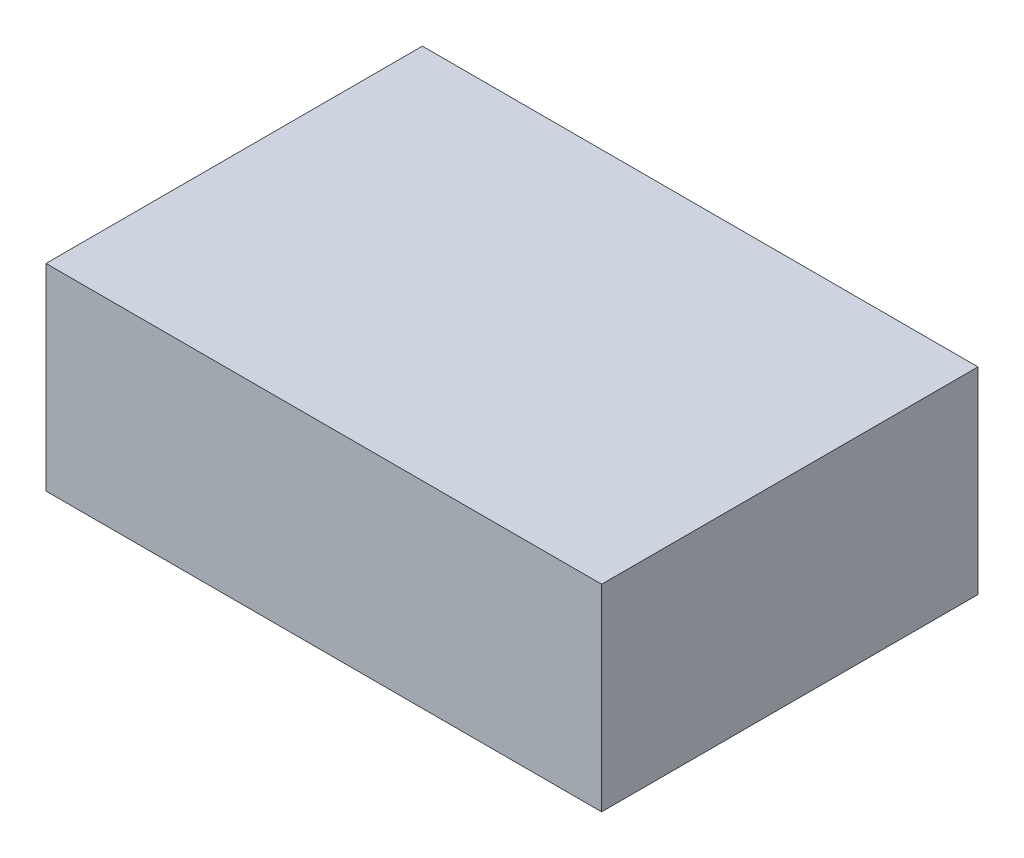
ISO-10303-21;
HEADER;
FILE_DESCRIPTION(('STEP AP214'),'2;1');
FILE_NAME('part.step','',(''),(''),'','','');
FILE_SCHEMA(('AUTOMOTIVE_DESIGN { 1 0 10303 214 1 1 1 1 }'));
ENDSEC;
DATA;
#1=APPLICATION_CONTEXT('core data for automotive mechanical design processes');
#2=APPLICATION_PROTOCOL_DEFINITION('international standard','automotive_design',2000,#1);
#3=PRODUCT_CONTEXT('',#1,'mechanical');
#4=PRODUCT('Part','Part','',(#3));
#5=PRODUCT_RELATED_PRODUCT_CATEGORY('part','',(#4));
#6=PRODUCT_DEFINITION_FORMATION('','',#4);
#7=PRODUCT_DEFINITION_CONTEXT('part definition',#1,'design');
#8=PRODUCT_DEFINITION('design','',#6,#7);
#9=PRODUCT_DEFINITION_SHAPE('','',#8);
#10=(LENGTH_UNIT() NAMED_UNIT(*) SI_UNIT(.MILLI.,.METRE.));
#11=(NAMED_UNIT(*) PLANE_ANGLE_UNIT() SI_UNIT($,.RADIAN.));
#12=(NAMED_UNIT(*) SI_UNIT($,.STERADIAN.) SOLID_ANGLE_UNIT());
#13=UNCERTAINTY_MEASURE_WITH_UNIT(LENGTH_MEASURE(1.E-05),#10,'distance_accuracy_value','');
#14=(GEOMETRIC_REPRESENTATION_CONTEXT(3) GLOBAL_UNCERTAINTY_ASSIGNED_CONTEXT((#13)) GLOBAL_UNIT_ASSIGNED_CONTEXT((#10,
#11,#12)) REPRESENTATION_CONTEXT('',''));
#15=CARTESIAN_POINT('',(0.,0.,0.));
#16=DIRECTION('',(0.,0.,1.));
#17=DIRECTION('',(1.,0.,0.));
#18=AXIS2_PLACEMENT_3D('',#15,#16,#17);
#19=CARTESIAN_POINT('',(0.,-152.4,-6096.));
#20=DIRECTION('',(0.,-1.,0.));
#21=DIRECTION('',(0.,0.,-1.));
#22=AXIS2_PLACEMENT_3D('',#19,#20,#21);
#23=PLANE('',#22);
#24=DIRECTION('',(0.,0.,1.));
#25=VECTOR('',#24,1.);
#26=CARTESIAN_POINT('',(-152.4,-152.4,-6096.));
#27=LINE('',#26,#25);
#28=CARTESIAN_POINT('',(-152.4,-152.4,-6248.4));
#29=VERTEX_POINT('',#28);
#30=CARTESIAN_POINT('',(-152.4,-152.4,152.4));
#31=VERTEX_POINT('',#30);
#32=EDGE_CURVE('E129',#29,#31,#27,.T.);
#33=ORIENTED_EDGE('',*,*,#32,.F.);
#34=DIRECTION('',(-1.,0.,0.));
#35=VECTOR('',#34,1.);
#36=CARTESIAN_POINT('',(0.,-152.4,-6248.4));
#37=LINE('',#36,#35);
#38=CARTESIAN_POINT('',(9296.4,-152.4,-6248.4));
#39=VERTEX_POINT('',#38);
#40=EDGE_CURVE('E106',#39,#29,#37,.T.);
#41=ORIENTED_EDGE('',*,*,#40,.F.);
#42=DIRECTION('',(0.,0.,-1.));
#43=VECTOR('',#42,1.);
#44=CARTESIAN_POINT('',(9296.4,-152.4,-6096.));
#45=LINE('',#44,#43);
#46=CARTESIAN_POINT('',(9296.4,-152.4,152.4));
#47=VERTEX_POINT('',#46);
#48=EDGE_CURVE('E115',#47,#39,#45,.T.);
#49=ORIENTED_EDGE('',*,*,#48,.F.);
#50=DIRECTION('',(1.,0.,0.));
#51=VECTOR('',#50,1.);
#52=CARTESIAN_POINT('',(0.,-152.4,152.4));
#53=LINE('',#52,#51);
#54=EDGE_CURVE('E123',#31,#47,#53,.T.);
#55=ORIENTED_EDGE('',*,*,#54,.F.);
#56=EDGE_LOOP('',(#33,#41,#49,#55));
#57=FACE_BOUND('',#56,.T.);
#58=CARTESIAN_POINT('',(4572.,-152.4,-3048.));
#59=DIRECTION('',(0.,-1.,0.));
#60=DIRECTION('',(0.,0.,-1.));
#61=AXIS2_PLACEMENT_3D('',#58,#59,#60);
#62=CIRCLE('',#61,596.298630589012);
#63=CARTESIAN_POINT('',(4572.,-152.4,-2451.70136941099));
#64=VERTEX_POINT('',#63);
#65=EDGE_CURVE('E144',#64,#64,#62,.T.);
#66=ORIENTED_EDGE('',*,*,#65,.F.);
#67=EDGE_LOOP('',(#66));
#68=FACE_BOUND('',#67,.T.);
#69=ADVANCED_FACE('F36',(#57,#68),#23,.T.);
#70=CARTESIAN_POINT('',(-152.4,3048.,0.));
#71=DIRECTION('',(1.,0.,0.));
#72=DIRECTION('',(0.,0.,-1.));
#73=AXIS2_PLACEMENT_3D('',#70,#71,#72);
#74=PLANE('',#73);
#75=ORIENTED_EDGE('',*,*,#32,.T.);
#76=DIRECTION('',(0.,-1.,0.));
#77=VECTOR('',#76,1.);
#78=CARTESIAN_POINT('',(-152.4,3048.,152.4));
#79=LINE('',#78,#77);
#80=CARTESIAN_POINT('',(-152.4,3200.4,152.4));
#81=VERTEX_POINT('',#80);
#82=EDGE_CURVE('E132',#81,#31,#79,.T.);
#83=ORIENTED_EDGE('',*,*,#82,.F.);
#84=DIRECTION('',(0.,0.,1.));
#85=VECTOR('',#84,1.);
#86=CARTESIAN_POINT('',(-152.4,3200.4,-6096.));
#87=LINE('',#86,#85);
#88=CARTESIAN_POINT('',(-152.4,3200.4,-6248.4));
#89=VERTEX_POINT('',#88);
#90=EDGE_CURVE('E148',#89,#81,#87,.T.);
#91=ORIENTED_EDGE('',*,*,#90,.F.);
#92=DIRECTION('',(0.,-1.,0.));
#93=VECTOR('',#92,1.);
#94=CARTESIAN_POINT('',(-152.4,3048.,-6248.4));
#95=LINE('',#94,#93);
#96=EDGE_CURVE('E140',#89,#29,#95,.T.);
#97=ORIENTED_EDGE('',*,*,#96,.T.);
#98=EDGE_LOOP('',(#75,#83,#91,#97));
#99=FACE_BOUND('',#98,.T.);
#100=ADVANCED_FACE('F139',(#99),#74,.F.);
#101=CARTESIAN_POINT('',(0.,3048.,152.4));
#102=DIRECTION('',(0.,0.,-1.));
#103=DIRECTION('',(-1.,0.,0.));
#104=AXIS2_PLACEMENT_3D('',#101,#102,#103);
#105=PLANE('',#104);
#106=ORIENTED_EDGE('',*,*,#54,.T.);
#107=DIRECTION('',(0.,-1.,0.));
#108=VECTOR('',#107,1.);
#109=CARTESIAN_POINT('',(9296.4,3048.,152.4));
#110=LINE('',#109,#108);
#111=CARTESIAN_POINT('',(9296.4,3200.4,152.4));
#112=VERTEX_POINT('',#111);
#113=EDGE_CURVE('E137',#112,#47,#110,.T.);
#114=ORIENTED_EDGE('',*,*,#113,.F.);
#115=DIRECTION('',(1.,0.,0.));
#116=VECTOR('',#115,1.);
#117=CARTESIAN_POINT('',(0.,3200.4,152.4));
#118=LINE('',#117,#116);
#119=EDGE_CURVE('E134',#81,#112,#118,.T.);
#120=ORIENTED_EDGE('',*,*,#119,.F.);
#121=ORIENTED_EDGE('',*,*,#82,.T.);
#122=EDGE_LOOP('',(#106,#114,#120,#121));
#123=FACE_BOUND('',#122,.T.);
#124=ADVANCED_FACE('F133',(#123),#105,.F.);
#125=CARTESIAN_POINT('',(9296.4,3048.,0.));
#126=DIRECTION('',(-1.,0.,0.));
#127=DIRECTION('',(0.,0.,1.));
#128=AXIS2_PLACEMENT_3D('',#125,#126,#127);
#129=PLANE('',#128);
#130=ORIENTED_EDGE('',*,*,#48,.T.);
#131=DIRECTION('',(0.,-1.,0.));
#132=VECTOR('',#131,1.);
#133=CARTESIAN_POINT('',(9296.4,3048.,-6248.4));
#134=LINE('',#133,#132);
#135=CARTESIAN_POINT('',(9296.4,3200.4,-6248.4));
#136=VERTEX_POINT('',#135);
#137=EDGE_CURVE('E150',#136,#39,#134,.T.);
#138=ORIENTED_EDGE('',*,*,#137,.F.);
#139=DIRECTION('',(0.,0.,-1.));
#140=VECTOR('',#139,1.);
#141=CARTESIAN_POINT('',(9296.4,3200.4,-6096.));
#142=LINE('',#141,#140);
#143=EDGE_CURVE('E95',#112,#136,#142,.T.);
#144=ORIENTED_EDGE('',*,*,#143,.F.);
#145=ORIENTED_EDGE('',*,*,#113,.T.);
#146=EDGE_LOOP('',(#130,#138,#144,#145));
#147=FACE_BOUND('',#146,.T.);
#148=ADVANCED_FACE('F216',(#147),#129,.F.);
#149=CARTESIAN_POINT('',(0.,3048.,-6248.4));
#150=DIRECTION('',(0.,0.,1.));
#151=DIRECTION('',(1.,0.,0.));
#152=AXIS2_PLACEMENT_3D('',#149,#150,#151);
#153=PLANE('',#152);
#154=ORIENTED_EDGE('',*,*,#40,.T.);
#155=ORIENTED_EDGE('',*,*,#96,.F.);
#156=DIRECTION('',(-1.,0.,0.));
#157=VECTOR('',#156,1.);
#158=CARTESIAN_POINT('',(0.,3200.4,-6248.4));
#159=LINE('',#158,#157);
#160=EDGE_CURVE('E89',#136,#89,#159,.T.);
#161=ORIENTED_EDGE('',*,*,#160,.F.);
#162=ORIENTED_EDGE('',*,*,#137,.T.);
#163=EDGE_LOOP('',(#154,#155,#161,#162));
#164=FACE_BOUND('',#163,.T.);
#165=ADVANCED_FACE('F213',(#164),#153,.F.);
#166=CARTESIAN_POINT('',(0.,3200.4,-6096.));
#167=DIRECTION('',(0.,-1.,0.));
#168=DIRECTION('',(0.,0.,-1.));
#169=AXIS2_PLACEMENT_3D('',#166,#167,#168);
#170=PLANE('',#169);
#171=ORIENTED_EDGE('',*,*,#90,.T.);
#172=ORIENTED_EDGE('',*,*,#119,.T.);
#173=ORIENTED_EDGE('',*,*,#143,.T.);
#174=ORIENTED_EDGE('',*,*,#160,.T.);
#175=EDGE_LOOP('',(#171,#172,#173,#174));
#176=FACE_BOUND('',#175,.T.);
#177=ADVANCED_FACE('F209',(#176),#170,.F.);
#178=CARTESIAN_POINT('',(4572.,-932.688,-3048.));
#179=DIRECTION('',(0.,1.,0.));
#180=DIRECTION('',(0.,0.,1.));
#181=AXIS2_PLACEMENT_3D('',#178,#179,#180);
#182=CYLINDRICAL_SURFACE('',#181,596.298630589012);
#183=CARTESIAN_POINT('',(4572.,-932.688,-3048.));
#184=DIRECTION('',(0.,-1.,0.));
#185=DIRECTION('',(0.,0.,-1.));
#186=AXIS2_PLACEMENT_3D('',#183,#184,#185);
#187=CIRCLE('',#186,596.298630589012);
#188=CARTESIAN_POINT('',(4572.,-932.688,-2451.70136941099));
#189=VERTEX_POINT('',#188);
#190=EDGE_CURVE('E141',#189,#189,#187,.T.);
#191=CARTESIAN_POINT('',(4572.,-932.688,-2451.70136941099));
#192=CARTESIAN_POINT('',(4572.,-924.56,-2451.70136941099));
#193=CARTESIAN_POINT('',(4572.,-916.432,-2451.70136941099));
#194=CARTESIAN_POINT('',(4572.,-900.176,-2451.70136941099));
#195=CARTESIAN_POINT('',(4572.,-892.048,-2451.70136941099));
#196=CARTESIAN_POINT('',(4572.,-875.792,-2451.70136941099));
#197=CARTESIAN_POINT('',(4572.,-867.664,-2451.70136941099));
#198=CARTESIAN_POINT('',(4572.,-851.408,-2451.70136941099));
#199=CARTESIAN_POINT('',(4572.,-843.28,-2451.70136941099));
#200=CARTESIAN_POINT('',(4572.,-827.024,-2451.70136941099));
#201=CARTESIAN_POINT('',(4572.,-818.896,-2451.70136941099));
#202=CARTESIAN_POINT('',(4572.,-802.64,-2451.70136941099));
#203=CARTESIAN_POINT('',(4572.,-794.512,-2451.70136941099));
#204=CARTESIAN_POINT('',(4572.,-778.256,-2451.70136941099));
#205=CARTESIAN_POINT('',(4572.,-770.128,-2451.70136941099));
#206=CARTESIAN_POINT('',(4572.,-753.872,-2451.70136941099));
#207=CARTESIAN_POINT('',(4572.,-745.744,-2451.70136941099));
#208=CARTESIAN_POINT('',(4572.,-729.488,-2451.70136941099));
#209=CARTESIAN_POINT('',(4572.,-721.36,-2451.70136941099));
#210=CARTESIAN_POINT('',(4572.,-705.104,-2451.70136941099));
#211=CARTESIAN_POINT('',(4572.,-696.976,-2451.70136941099));
#212=CARTESIAN_POINT('',(4572.,-680.72,-2451.70136941099));
#213=CARTESIAN_POINT('',(4572.,-672.592,-2451.70136941099));
#214=CARTESIAN_POINT('',(4572.,-656.336,-2451.70136941099));
#215=CARTESIAN_POINT('',(4572.,-648.208,-2451.70136941099));
#216=CARTESIAN_POINT('',(4572.,-631.952,-2451.70136941099));
#217=CARTESIAN_POINT('',(4572.,-623.824,-2451.70136941099));
#218=CARTESIAN_POINT('',(4572.,-607.568,-2451.70136941099));
#219=CARTESIAN_POINT('',(4572.,-599.44,-2451.70136941099));
#220=CARTESIAN_POINT('',(4572.,-583.184,-2451.70136941099));
#221=CARTESIAN_POINT('',(4572.,-575.056,-2451.70136941099));
#222=CARTESIAN_POINT('',(4572.,-558.8,-2451.70136941099));
#223=CARTESIAN_POINT('',(4572.,-550.672,-2451.70136941099));
#224=CARTESIAN_POINT('',(4572.,-534.416,-2451.70136941099));
#225=CARTESIAN_POINT('',(4572.,-526.288,-2451.70136941099));
#226=CARTESIAN_POINT('',(4572.,-510.032,-2451.70136941099));
#227=CARTESIAN_POINT('',(4572.,-501.904,-2451.70136941099));
#228=CARTESIAN_POINT('',(4572.,-485.648,-2451.70136941099));
#229=CARTESIAN_POINT('',(4572.,-477.52,-2451.70136941099));
#230=CARTESIAN_POINT('',(4572.,-461.264,-2451.70136941099));
#231=CARTESIAN_POINT('',(4572.,-453.136,-2451.70136941099));
#232=CARTESIAN_POINT('',(4572.,-436.88,-2451.70136941099));
#233=CARTESIAN_POINT('',(4572.,-428.752,-2451.70136941099));
#234=CARTESIAN_POINT('',(4572.,-412.496,-2451.70136941099));
#235=CARTESIAN_POINT('',(4572.,-404.368,-2451.70136941099));
#236=CARTESIAN_POINT('',(4572.,-388.112,-2451.70136941099));
#237=CARTESIAN_POINT('',(4572.,-379.984,-2451.70136941099));
#238=CARTESIAN_POINT('',(4572.,-363.728,-2451.70136941099));
#239=CARTESIAN_POINT('',(4572.,-355.6,-2451.70136941099));
#240=CARTESIAN_POINT('',(4572.,-339.344,-2451.70136941099));
#241=CARTESIAN_POINT('',(4572.,-331.216,-2451.70136941099));
#242=CARTESIAN_POINT('',(4572.,-314.96,-2451.70136941099));
#243=CARTESIAN_POINT('',(4572.,-306.832,-2451.70136941099));
#244=CARTESIAN_POINT('',(4572.,-290.576,-2451.70136941099));
#245=CARTESIAN_POINT('',(4572.,-282.448,-2451.70136941099));
#246=CARTESIAN_POINT('',(4572.,-266.192,-2451.70136941099));
#247=CARTESIAN_POINT('',(4572.,-258.064,-2451.70136941099));
#248=CARTESIAN_POINT('',(4572.,-241.808,-2451.70136941099));
#249=CARTESIAN_POINT('',(4572.,-233.68,-2451.70136941099));
#250=CARTESIAN_POINT('',(4572.,-217.424,-2451.70136941099));
#251=CARTESIAN_POINT('',(4572.,-209.296,-2451.70136941099));
#252=CARTESIAN_POINT('',(4572.,-193.04,-2451.70136941099));
#253=CARTESIAN_POINT('',(4572.,-184.912,-2451.70136941099));
#254=CARTESIAN_POINT('',(4572.,-168.656,-2451.70136941099));
#255=CARTESIAN_POINT('',(4572.,-160.528,-2451.70136941099));
#256=CARTESIAN_POINT('',(4572.,-152.4,-2451.70136941099));
#257=B_SPLINE_CURVE_WITH_KNOTS('',3,(#191,#192,#193,#194,#195,#196,#197,#198,#199,#200,#201,
#202,#203,#204,#205,#206,#207,#208,#209,#210,#211,#212,#213,#214,#215,#216,#217,#218,#219,#220,
#221,#222,#223,#224,#225,#226,#227,#228,#229,#230,#231,#232,#233,#234,#235,#236,#237,#238,#239,
#240,#241,#242,#243,#244,#245,#246,#247,#248,#249,#250,#251,#252,#253,#254,#255,#256),
.UNSPECIFIED.,.F.,.F.,(4,2,2,2,2,2,2,2,2,2,2,2,2,2,2,2,2,2,2,2,2,2,2,2,2,2,2,2,2,2,2,2,4),(0.,
24.384,48.7679999999999,73.1519999999999,97.536,121.92,146.304,170.688,195.072,219.456,243.84,
268.224,292.608,316.992,341.376,365.76,390.144,414.528,438.912,463.296,487.68,512.064,536.448,
560.832,585.216,609.6,633.984,658.368,682.752,707.136,731.52,755.904,780.288),.UNSPECIFIED.);
#258=EDGE_CURVE('BSEAM212',#189,#64,#257,.T.);
#259=ORIENTED_EDGE('',*,*,#190,.F.);
#260=ORIENTED_EDGE('',*,*,#65,.T.);
#261=ORIENTED_EDGE('',*,*,#258,.T.);
#262=ORIENTED_EDGE('',*,*,#258,.F.);
#263=EDGE_LOOP('',(#259,#261,#260,#262));
#264=FACE_BOUND('',#263,.T.);
#265=ADVANCED_FACE('F212',(#264),#182,.T.);
#266=CARTESIAN_POINT('',(4572.,-932.688,-3048.));
#267=DIRECTION('',(0.,-1.,0.));
#268=DIRECTION('',(0.,0.,-1.));
#269=AXIS2_PLACEMENT_3D('',#266,#267,#268);
#270=PLANE('',#269);
#271=ORIENTED_EDGE('',*,*,#190,.T.);
#272=EDGE_LOOP('',(#271));
#273=FACE_BOUND('',#272,.T.);
#274=ADVANCED_FACE('F225',(#273),#270,.T.);
#275=CLOSED_SHELL('',(#69,#100,#124,#148,#165,#177,#265,#274));
#276=CARTESIAN_POINT('',(0.,3048.,0.));
#277=DIRECTION('',(1.,0.,0.));
#278=DIRECTION('',(0.,0.,-1.));
#279=AXIS2_PLACEMENT_3D('',#276,#277,#278);
#280=PLANE('',#279);
#281=DIRECTION('',(0.,0.,1.));
#282=VECTOR('',#281,1.);
#283=CARTESIAN_POINT('',(0.,0.,0.));
#284=LINE('',#283,#282);
#285=CARTESIAN_POINT('',(0.,0.,-6096.));
#286=VERTEX_POINT('',#285);
#287=CARTESIAN_POINT('',(0.,0.,0.));
#288=VERTEX_POINT('',#287);
#289=EDGE_CURVE('E40',#286,#288,#284,.T.);
#290=ORIENTED_EDGE('',*,*,#289,.F.);
#291=DIRECTION('',(0.,-1.,0.));
#292=VECTOR('',#291,1.);
#293=CARTESIAN_POINT('',(0.,3048.,-6096.));
#294=LINE('',#293,#292);
#295=CARTESIAN_POINT('',(0.,3048.,-6096.));
#296=VERTEX_POINT('',#295);
#297=EDGE_CURVE('E174',#296,#286,#294,.T.);
#298=ORIENTED_EDGE('',*,*,#297,.F.);
#299=DIRECTION('',(0.,0.,1.));
#300=VECTOR('',#299,1.);
#301=CARTESIAN_POINT('',(0.,3048.,0.));
#302=LINE('',#301,#300);
#303=CARTESIAN_POINT('',(0.,3048.,0.));
#304=VERTEX_POINT('',#303);
#305=EDGE_CURVE('E161',#296,#304,#302,.T.);
#306=ORIENTED_EDGE('',*,*,#305,.T.);
#307=DIRECTION('',(0.,-1.,0.));
#308=VECTOR('',#307,1.);
#309=CARTESIAN_POINT('',(0.,3048.,0.));
#310=LINE('',#309,#308);
#311=EDGE_CURVE('E172',#304,#288,#310,.T.);
#312=ORIENTED_EDGE('',*,*,#311,.T.);
#313=EDGE_LOOP('',(#290,#298,#306,#312));
#314=FACE_BOUND('',#313,.T.);
#315=ADVANCED_FACE('F181',(#314),#280,.T.);
#316=CARTESIAN_POINT('',(0.,3048.,0.));
#317=DIRECTION('',(0.,0.,-1.));
#318=DIRECTION('',(-1.,0.,0.));
#319=AXIS2_PLACEMENT_3D('',#316,#317,#318);
#320=PLANE('',#319);
#321=DIRECTION('',(1.,0.,0.));
#322=VECTOR('',#321,1.);
#323=CARTESIAN_POINT('',(0.,0.,0.));
#324=LINE('',#323,#322);
#325=CARTESIAN_POINT('',(9144.,0.,0.));
#326=VERTEX_POINT('',#325);
#327=EDGE_CURVE('E56',#288,#326,#324,.T.);
#328=ORIENTED_EDGE('',*,*,#327,.F.);
#329=ORIENTED_EDGE('',*,*,#311,.F.);
#330=DIRECTION('',(1.,0.,0.));
#331=VECTOR('',#330,1.);
#332=CARTESIAN_POINT('',(0.,3048.,0.));
#333=LINE('',#332,#331);
#334=CARTESIAN_POINT('',(9144.,3048.,0.));
#335=VERTEX_POINT('',#334);
#336=EDGE_CURVE('E79',#304,#335,#333,.T.);
#337=ORIENTED_EDGE('',*,*,#336,.T.);
#338=DIRECTION('',(0.,-1.,0.));
#339=VECTOR('',#338,1.);
#340=CARTESIAN_POINT('',(9144.,3048.,0.));
#341=LINE('',#340,#339);
#342=EDGE_CURVE('E168',#335,#326,#341,.T.);
#343=ORIENTED_EDGE('',*,*,#342,.T.);
#344=EDGE_LOOP('',(#328,#329,#337,#343));
#345=FACE_BOUND('',#344,.T.);
#346=ADVANCED_FACE('F182',(#345),#320,.T.);
#347=CARTESIAN_POINT('',(9144.,3048.,0.));
#348=DIRECTION('',(-1.,0.,0.));
#349=DIRECTION('',(0.,0.,1.));
#350=AXIS2_PLACEMENT_3D('',#347,#348,#349);
#351=PLANE('',#350);
#352=DIRECTION('',(0.,0.,-1.));
#353=VECTOR('',#352,1.);
#354=CARTESIAN_POINT('',(9144.,0.,0.));
#355=LINE('',#354,#353);
#356=CARTESIAN_POINT('',(9144.,0.,-6096.));
#357=VERTEX_POINT('',#356);
#358=EDGE_CURVE('E170',#326,#357,#355,.T.);
#359=ORIENTED_EDGE('',*,*,#358,.F.);
#360=ORIENTED_EDGE('',*,*,#342,.F.);
#361=DIRECTION('',(0.,0.,-1.));
#362=VECTOR('',#361,1.);
#363=CARTESIAN_POINT('',(9144.,3048.,0.));
#364=LINE('',#363,#362);
#365=CARTESIAN_POINT('',(9144.,3048.,-6096.));
#366=VERTEX_POINT('',#365);
#367=EDGE_CURVE('E47',#335,#366,#364,.T.);
#368=ORIENTED_EDGE('',*,*,#367,.T.);
#369=DIRECTION('',(0.,-1.,0.));
#370=VECTOR('',#369,1.);
#371=CARTESIAN_POINT('',(9144.,3048.,-6096.));
#372=LINE('',#371,#370);
#373=EDGE_CURVE('E163',#366,#357,#372,.T.);
#374=ORIENTED_EDGE('',*,*,#373,.T.);
#375=EDGE_LOOP('',(#359,#360,#368,#374));
#376=FACE_BOUND('',#375,.T.);
#377=ADVANCED_FACE('F186',(#376),#351,.T.);
#378=CARTESIAN_POINT('',(0.,3048.,-6096.));
#379=DIRECTION('',(0.,0.,1.));
#380=DIRECTION('',(1.,0.,0.));
#381=AXIS2_PLACEMENT_3D('',#378,#379,#380);
#382=PLANE('',#381);
#383=DIRECTION('',(-1.,0.,0.));
#384=VECTOR('',#383,1.);
#385=CARTESIAN_POINT('',(0.,0.,-6096.));
#386=LINE('',#385,#384);
#387=EDGE_CURVE('E166',#357,#286,#386,.T.);
#388=ORIENTED_EDGE('',*,*,#387,.F.);
#389=ORIENTED_EDGE('',*,*,#373,.F.);
#390=DIRECTION('',(-1.,0.,0.));
#391=VECTOR('',#390,1.);
#392=CARTESIAN_POINT('',(0.,3048.,-6096.));
#393=LINE('',#392,#391);
#394=EDGE_CURVE('E11',#366,#296,#393,.T.);
#395=ORIENTED_EDGE('',*,*,#394,.T.);
#396=ORIENTED_EDGE('',*,*,#297,.T.);
#397=EDGE_LOOP('',(#388,#389,#395,#396));
#398=FACE_BOUND('',#397,.T.);
#399=ADVANCED_FACE('F190',(#398),#382,.T.);
#400=CARTESIAN_POINT('',(0.,3048.,-6096.));
#401=DIRECTION('',(0.,-1.,0.));
#402=DIRECTION('',(0.,0.,-1.));
#403=AXIS2_PLACEMENT_3D('',#400,#401,#402);
#404=PLANE('',#403);
#405=ORIENTED_EDGE('',*,*,#305,.F.);
#406=ORIENTED_EDGE('',*,*,#394,.F.);
#407=ORIENTED_EDGE('',*,*,#367,.F.);
#408=ORIENTED_EDGE('',*,*,#336,.F.);
#409=EDGE_LOOP('',(#405,#406,#407,#408));
#410=FACE_BOUND('',#409,.T.);
#411=ADVANCED_FACE('F189',(#410),#404,.T.);
#412=CARTESIAN_POINT('',(0.,0.,-6096.));
#413=DIRECTION('',(0.,-1.,0.));
#414=DIRECTION('',(0.,0.,-1.));
#415=AXIS2_PLACEMENT_3D('',#412,#413,#414);
#416=PLANE('',#415);
#417=ORIENTED_EDGE('',*,*,#289,.T.);
#418=ORIENTED_EDGE('',*,*,#327,.T.);
#419=ORIENTED_EDGE('',*,*,#358,.T.);
#420=ORIENTED_EDGE('',*,*,#387,.T.);
#421=EDGE_LOOP('',(#417,#418,#419,#420));
#422=FACE_BOUND('',#421,.T.);
#423=ADVANCED_FACE('F38',(#422),#416,.F.);
#424=CLOSED_SHELL('',(#315,#346,#377,#399,#411,#423));
#425=ORIENTED_CLOSED_SHELL('',*,#424,.T.);
#426=BREP_WITH_VOIDS('B2',#275,(#425));
#427=ADVANCED_BREP_SHAPE_REPRESENTATION('',(#18,#426),#14);
#428=SHAPE_DEFINITION_REPRESENTATION(#9,#427);
ENDSEC;
END-ISO-10303-21;
